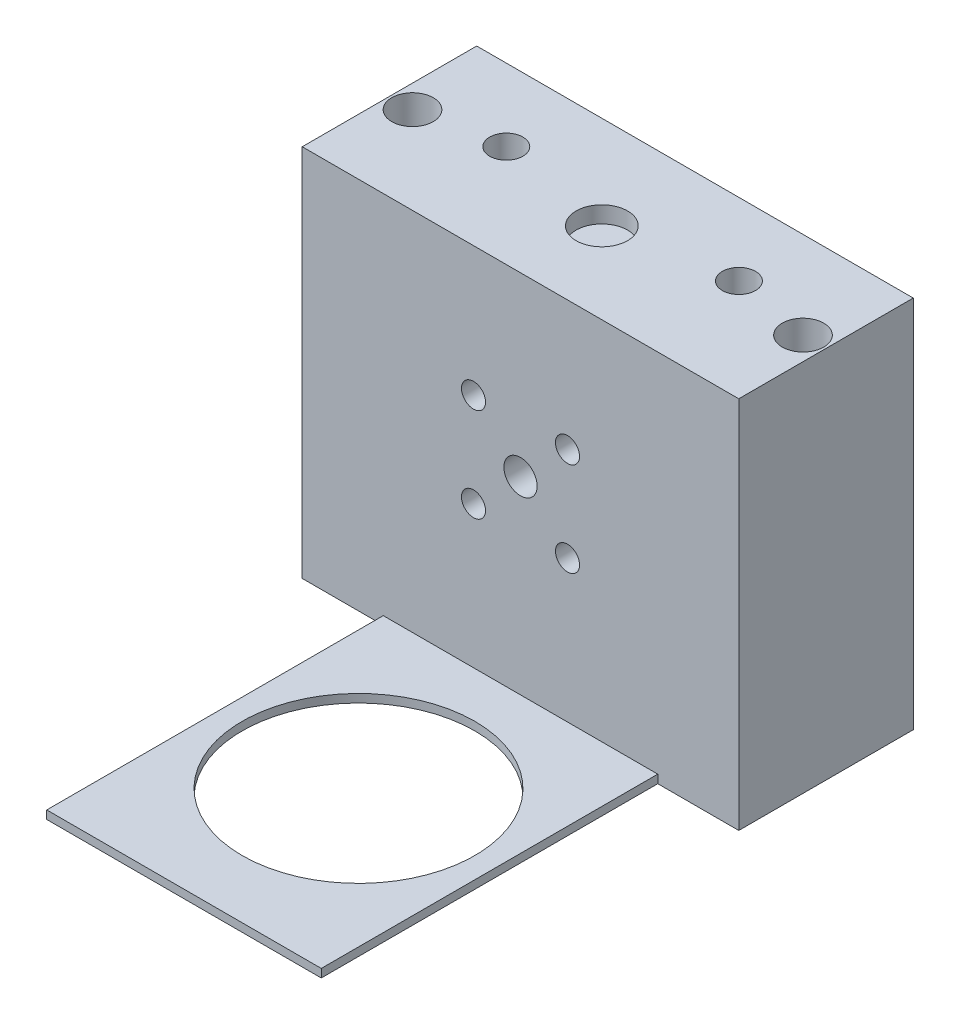
ISO-10303-21;
HEADER;
FILE_DESCRIPTION(('STEP AP214'),'2;1');
FILE_NAME('part.step','',(''),(''),'','','');
FILE_SCHEMA(('AUTOMOTIVE_DESIGN { 1 0 10303 214 1 1 1 1 }'));
ENDSEC;
DATA;
#1=APPLICATION_CONTEXT('core data for automotive mechanical design processes');
#2=APPLICATION_PROTOCOL_DEFINITION('international standard','automotive_design',2000,#1);
#3=PRODUCT_CONTEXT('',#1,'mechanical');
#4=PRODUCT('Part','Part','',(#3));
#5=PRODUCT_RELATED_PRODUCT_CATEGORY('part','',(#4));
#6=PRODUCT_DEFINITION_FORMATION('','',#4);
#7=PRODUCT_DEFINITION_CONTEXT('part definition',#1,'design');
#8=PRODUCT_DEFINITION('design','',#6,#7);
#9=PRODUCT_DEFINITION_SHAPE('','',#8);
#10=(LENGTH_UNIT() NAMED_UNIT(*) SI_UNIT(.MILLI.,.METRE.));
#11=(NAMED_UNIT(*) PLANE_ANGLE_UNIT() SI_UNIT($,.RADIAN.));
#12=(NAMED_UNIT(*) SI_UNIT($,.STERADIAN.) SOLID_ANGLE_UNIT());
#13=UNCERTAINTY_MEASURE_WITH_UNIT(LENGTH_MEASURE(1.E-05),#10,'distance_accuracy_value','');
#14=(GEOMETRIC_REPRESENTATION_CONTEXT(3) GLOBAL_UNCERTAINTY_ASSIGNED_CONTEXT((#13)) GLOBAL_UNIT_ASSIGNED_CONTEXT((#10,
#11,#12)) REPRESENTATION_CONTEXT('',''));
#15=CARTESIAN_POINT('',(0.,0.,0.));
#16=DIRECTION('',(0.,0.,1.));
#17=DIRECTION('',(1.,0.,0.));
#18=AXIS2_PLACEMENT_3D('',#15,#16,#17);
#19=CARTESIAN_POINT('',(-26.27,45.,10.5));
#20=DIRECTION('',(0.,0.,-1.));
#21=DIRECTION('',(-1.,0.,0.));
#22=AXIS2_PLACEMENT_3D('',#19,#20,#21);
#23=PLANE('',#22);
#24=CARTESIAN_POINT('',(0.,23.75,10.5));
#25=DIRECTION('',(0.,0.,-1.));
#26=DIRECTION('',(-1.,0.,0.));
#27=AXIS2_PLACEMENT_3D('',#24,#25,#26);
#28=CIRCLE('',#27,2.);
#29=CARTESIAN_POINT('',(-2.,23.75,10.5));
#30=VERTEX_POINT('',#29);
#31=EDGE_CURVE('E208',#30,#30,#28,.T.);
#32=ORIENTED_EDGE('',*,*,#31,.T.);
#33=EDGE_LOOP('',(#32));
#34=FACE_BOUND('',#33,.T.);
#35=CARTESIAN_POINT('',(-5.65685424949243,29.4068542494924,10.5));
#36=DIRECTION('',(0.,0.,-1.));
#37=DIRECTION('',(-1.,0.,0.));
#38=AXIS2_PLACEMENT_3D('',#35,#36,#37);
#39=CIRCLE('',#38,1.44999999999999);
#40=CARTESIAN_POINT('',(-7.10685424949243,29.4068542494924,10.5));
#41=VERTEX_POINT('',#40);
#42=EDGE_CURVE('E192',#41,#41,#39,.T.);
#43=ORIENTED_EDGE('',*,*,#42,.T.);
#44=EDGE_LOOP('',(#43));
#45=FACE_BOUND('',#44,.T.);
#46=CARTESIAN_POINT('',(5.65685424949234,29.4068542494924,10.5));
#47=DIRECTION('',(0.,0.,-1.));
#48=DIRECTION('',(-1.,0.,0.));
#49=AXIS2_PLACEMENT_3D('',#46,#47,#48);
#50=CIRCLE('',#49,1.44999999999999);
#51=CARTESIAN_POINT('',(4.20685424949234,29.4068542494924,10.5));
#52=VERTEX_POINT('',#51);
#53=EDGE_CURVE('E180',#52,#52,#50,.T.);
#54=ORIENTED_EDGE('',*,*,#53,.T.);
#55=EDGE_LOOP('',(#54));
#56=FACE_BOUND('',#55,.T.);
#57=CARTESIAN_POINT('',(5.65685424949242,18.0931457505077,10.5));
#58=DIRECTION('',(0.,0.,-1.));
#59=DIRECTION('',(-1.,0.,0.));
#60=AXIS2_PLACEMENT_3D('',#57,#58,#59);
#61=CIRCLE('',#60,1.44999999999999);
#62=CARTESIAN_POINT('',(4.20685424949243,18.0931457505077,10.5));
#63=VERTEX_POINT('',#62);
#64=EDGE_CURVE('E168',#63,#63,#61,.T.);
#65=ORIENTED_EDGE('',*,*,#64,.T.);
#66=EDGE_LOOP('',(#65));
#67=FACE_BOUND('',#66,.T.);
#68=CARTESIAN_POINT('',(-5.65685424949234,18.0931457505076,10.5));
#69=DIRECTION('',(0.,0.,-1.));
#70=DIRECTION('',(-1.,0.,0.));
#71=AXIS2_PLACEMENT_3D('',#68,#69,#70);
#72=CIRCLE('',#71,1.44999999999999);
#73=CARTESIAN_POINT('',(-7.10685424949233,18.0931457505076,10.5));
#74=VERTEX_POINT('',#73);
#75=EDGE_CURVE('E156',#74,#74,#72,.T.);
#76=ORIENTED_EDGE('',*,*,#75,.T.);
#77=EDGE_LOOP('',(#76));
#78=FACE_BOUND('',#77,.T.);
#79=DIRECTION('',(0.,-1.,0.));
#80=VECTOR('',#79,1.);
#81=CARTESIAN_POINT('',(-16.52,1.,10.5));
#82=LINE('',#81,#80);
#83=CARTESIAN_POINT('',(-16.52,1.,10.5));
#84=VERTEX_POINT('',#83);
#85=CARTESIAN_POINT('',(-16.52,0.,10.5));
#86=VERTEX_POINT('',#85);
#87=EDGE_CURVE('E124',#84,#86,#82,.T.);
#88=ORIENTED_EDGE('',*,*,#87,.F.);
#89=DIRECTION('',(1.,0.,0.));
#90=VECTOR('',#89,1.);
#91=CARTESIAN_POINT('',(-16.52,1.,10.5));
#92=LINE('',#91,#90);
#93=CARTESIAN_POINT('',(16.52,1.,10.5));
#94=VERTEX_POINT('',#93);
#95=EDGE_CURVE('E111',#84,#94,#92,.T.);
#96=ORIENTED_EDGE('',*,*,#95,.T.);
#97=DIRECTION('',(0.,-1.,0.));
#98=VECTOR('',#97,1.);
#99=CARTESIAN_POINT('',(16.52,1.,10.5));
#100=LINE('',#99,#98);
#101=CARTESIAN_POINT('',(16.52,0.,10.5));
#102=VERTEX_POINT('',#101);
#103=EDGE_CURVE('E133',#94,#102,#100,.T.);
#104=ORIENTED_EDGE('',*,*,#103,.T.);
#105=DIRECTION('',(1.,0.,0.));
#106=VECTOR('',#105,1.);
#107=CARTESIAN_POINT('',(-26.27,0.,10.5));
#108=LINE('',#107,#106);
#109=CARTESIAN_POINT('',(26.27,0.,10.5));
#110=VERTEX_POINT('',#109);
#111=EDGE_CURVE('E81',#102,#110,#108,.T.);
#112=ORIENTED_EDGE('',*,*,#111,.T.);
#113=DIRECTION('',(0.,-1.,0.));
#114=VECTOR('',#113,1.);
#115=CARTESIAN_POINT('',(26.27,45.,10.5));
#116=LINE('',#115,#114);
#117=CARTESIAN_POINT('',(26.27,45.,10.5));
#118=VERTEX_POINT('',#117);
#119=EDGE_CURVE('E232',#118,#110,#116,.T.);
#120=ORIENTED_EDGE('',*,*,#119,.F.);
#121=DIRECTION('',(1.,0.,0.));
#122=VECTOR('',#121,1.);
#123=CARTESIAN_POINT('',(-26.27,45.,10.5));
#124=LINE('',#123,#122);
#125=CARTESIAN_POINT('',(-26.27,45.,10.5));
#126=VERTEX_POINT('',#125);
#127=EDGE_CURVE('E61',#126,#118,#124,.T.);
#128=ORIENTED_EDGE('',*,*,#127,.F.);
#129=DIRECTION('',(0.,-1.,0.));
#130=VECTOR('',#129,1.);
#131=CARTESIAN_POINT('',(-26.27,45.,10.5));
#132=LINE('',#131,#130);
#133=CARTESIAN_POINT('',(-26.27,0.,10.5));
#134=VERTEX_POINT('',#133);
#135=EDGE_CURVE('E241',#126,#134,#132,.T.);
#136=ORIENTED_EDGE('',*,*,#135,.T.);
#137=EDGE_CURVE('E132',#134,#86,#108,.T.);
#138=ORIENTED_EDGE('',*,*,#137,.T.);
#139=EDGE_LOOP('',(#88,#96,#104,#112,#120,#128,#136,#138));
#140=FACE_BOUND('',#139,.T.);
#141=ADVANCED_FACE('F37',(#34,#45,#56,#67,#78,#140),#23,.F.);
#142=CARTESIAN_POINT('',(0.,45.,0.));
#143=DIRECTION('',(0.,-1.,0.));
#144=DIRECTION('',(0.,0.,-1.));
#145=AXIS2_PLACEMENT_3D('',#142,#143,#144);
#146=PLANE('',#145);
#147=CARTESIAN_POINT('',(0.,45.,0.710000000000004));
#148=DIRECTION('',(0.,1.,0.));
#149=DIRECTION('',(0.,0.,1.));
#150=AXIS2_PLACEMENT_3D('',#147,#148,#149);
#151=CIRCLE('',#150,3.1);
#152=CARTESIAN_POINT('',(0.,45.,3.81));
#153=VERTEX_POINT('',#152);
#154=EDGE_CURVE('E145',#153,#153,#151,.T.);
#155=ORIENTED_EDGE('',*,*,#154,.F.);
#156=EDGE_LOOP('',(#155));
#157=FACE_BOUND('',#156,.T.);
#158=CARTESIAN_POINT('',(-14.,45.,-1.79));
#159=DIRECTION('',(0.,1.,0.));
#160=DIRECTION('',(0.,0.,1.));
#161=AXIS2_PLACEMENT_3D('',#158,#159,#160);
#162=CIRCLE('',#161,2.);
#163=CARTESIAN_POINT('',(-14.,45.,0.21));
#164=VERTEX_POINT('',#163);
#165=EDGE_CURVE('E200',#164,#164,#162,.T.);
#166=ORIENTED_EDGE('',*,*,#165,.F.);
#167=EDGE_LOOP('',(#166));
#168=FACE_BOUND('',#167,.T.);
#169=CARTESIAN_POINT('',(14.,45.,-1.79));
#170=DIRECTION('',(0.,1.,0.));
#171=DIRECTION('',(0.,0.,1.));
#172=AXIS2_PLACEMENT_3D('',#169,#170,#171);
#173=CIRCLE('',#172,2.);
#174=CARTESIAN_POINT('',(14.,45.,0.210000000000001));
#175=VERTEX_POINT('',#174);
#176=EDGE_CURVE('E203',#175,#175,#173,.T.);
#177=ORIENTED_EDGE('',*,*,#176,.F.);
#178=EDGE_LOOP('',(#177));
#179=FACE_BOUND('',#178,.T.);
#180=DIRECTION('',(0.,0.,-1.));
#181=VECTOR('',#180,1.);
#182=CARTESIAN_POINT('',(26.27,45.,10.5));
#183=LINE('',#182,#181);
#184=CARTESIAN_POINT('',(26.27,45.,-10.5));
#185=VERTEX_POINT('',#184);
#186=EDGE_CURVE('E226',#118,#185,#183,.T.);
#187=ORIENTED_EDGE('',*,*,#186,.T.);
#188=DIRECTION('',(-1.,0.,0.));
#189=VECTOR('',#188,1.);
#190=CARTESIAN_POINT('',(-26.27,45.,-10.5));
#191=LINE('',#190,#189);
#192=CARTESIAN_POINT('',(-26.27,45.,-10.5));
#193=VERTEX_POINT('',#192);
#194=EDGE_CURVE('E88',#185,#193,#191,.T.);
#195=ORIENTED_EDGE('',*,*,#194,.T.);
#196=DIRECTION('',(0.,0.,1.));
#197=VECTOR('',#196,1.);
#198=CARTESIAN_POINT('',(-26.27,45.,10.5));
#199=LINE('',#198,#197);
#200=EDGE_CURVE('E229',#193,#126,#199,.T.);
#201=ORIENTED_EDGE('',*,*,#200,.T.);
#202=ORIENTED_EDGE('',*,*,#127,.T.);
#203=EDGE_LOOP('',(#187,#195,#201,#202));
#204=FACE_BOUND('',#203,.T.);
#205=CARTESIAN_POINT('',(23.5,45.,0.));
#206=DIRECTION('',(0.,1.,0.));
#207=DIRECTION('',(0.,0.,1.));
#208=AXIS2_PLACEMENT_3D('',#205,#206,#207);
#209=CIRCLE('',#208,2.5);
#210=CARTESIAN_POINT('',(23.5,45.,-2.50000000000001));
#211=VERTEX_POINT('',#210);
#212=EDGE_CURVE('E220',#211,#211,#209,.T.);
#213=ORIENTED_EDGE('',*,*,#212,.F.);
#214=EDGE_LOOP('',(#213));
#215=FACE_BOUND('',#214,.T.);
#216=CARTESIAN_POINT('',(-23.5,45.,0.));
#217=DIRECTION('',(0.,1.,0.));
#218=DIRECTION('',(0.,0.,1.));
#219=AXIS2_PLACEMENT_3D('',#216,#217,#218);
#220=CIRCLE('',#219,2.5);
#221=CARTESIAN_POINT('',(-23.5,45.,-2.5));
#222=VERTEX_POINT('',#221);
#223=EDGE_CURVE('E214',#222,#222,#220,.T.);
#224=ORIENTED_EDGE('',*,*,#223,.F.);
#225=EDGE_LOOP('',(#224));
#226=FACE_BOUND('',#225,.T.);
#227=ADVANCED_FACE('F278',(#157,#168,#179,#204,#215,#226),#146,.F.);
#228=CARTESIAN_POINT('',(0.,0.,0.));
#229=DIRECTION('',(0.,-1.,0.));
#230=DIRECTION('',(0.,0.,-1.));
#231=AXIS2_PLACEMENT_3D('',#228,#229,#230);
#232=PLANE('',#231);
#233=CARTESIAN_POINT('',(23.5,0.,0.));
#234=DIRECTION('',(0.,1.,0.));
#235=DIRECTION('',(0.,0.,1.));
#236=AXIS2_PLACEMENT_3D('',#233,#234,#235);
#237=CIRCLE('',#236,2.5);
#238=CARTESIAN_POINT('',(23.5,0.,-2.50000000000001));
#239=VERTEX_POINT('',#238);
#240=EDGE_CURVE('E217',#239,#239,#237,.T.);
#241=ORIENTED_EDGE('',*,*,#240,.T.);
#242=EDGE_LOOP('',(#241));
#243=FACE_BOUND('',#242,.T.);
#244=DIRECTION('',(0.,0.,-1.));
#245=VECTOR('',#244,1.);
#246=CARTESIAN_POINT('',(26.27,0.,10.5));
#247=LINE('',#246,#245);
#248=CARTESIAN_POINT('',(26.27,0.,-10.5));
#249=VERTEX_POINT('',#248);
#250=EDGE_CURVE('E223',#110,#249,#247,.T.);
#251=ORIENTED_EDGE('',*,*,#250,.F.);
#252=ORIENTED_EDGE('',*,*,#111,.F.);
#253=DIRECTION('',(0.,0.,1.));
#254=VECTOR('',#253,1.);
#255=CARTESIAN_POINT('',(16.52,0.,10.5));
#256=LINE('',#255,#254);
#257=CARTESIAN_POINT('',(16.52,0.,51.));
#258=VERTEX_POINT('',#257);
#259=EDGE_CURVE('E52',#102,#258,#256,.T.);
#260=ORIENTED_EDGE('',*,*,#259,.T.);
#261=DIRECTION('',(-1.,0.,0.));
#262=VECTOR('',#261,1.);
#263=CARTESIAN_POINT('',(-16.52,0.,51.));
#264=LINE('',#263,#262);
#265=CARTESIAN_POINT('',(-16.52,0.,51.));
#266=VERTEX_POINT('',#265);
#267=EDGE_CURVE('E127',#258,#266,#264,.T.);
#268=ORIENTED_EDGE('',*,*,#267,.T.);
#269=DIRECTION('',(0.,0.,-1.));
#270=VECTOR('',#269,1.);
#271=CARTESIAN_POINT('',(-16.52,0.,10.5));
#272=LINE('',#271,#270);
#273=EDGE_CURVE('E253',#266,#86,#272,.T.);
#274=ORIENTED_EDGE('',*,*,#273,.T.);
#275=ORIENTED_EDGE('',*,*,#137,.F.);
#276=DIRECTION('',(0.,0.,1.));
#277=VECTOR('',#276,1.);
#278=CARTESIAN_POINT('',(-26.27,0.,10.5));
#279=LINE('',#278,#277);
#280=CARTESIAN_POINT('',(-26.27,0.,-10.5));
#281=VERTEX_POINT('',#280);
#282=EDGE_CURVE('E237',#281,#134,#279,.T.);
#283=ORIENTED_EDGE('',*,*,#282,.F.);
#284=DIRECTION('',(-1.,0.,0.));
#285=VECTOR('',#284,1.);
#286=CARTESIAN_POINT('',(-26.27,0.,-10.5));
#287=LINE('',#286,#285);
#288=EDGE_CURVE('E235',#249,#281,#287,.T.);
#289=ORIENTED_EDGE('',*,*,#288,.F.);
#290=EDGE_LOOP('',(#251,#252,#260,#268,#274,#275,#283,#289));
#291=FACE_BOUND('',#290,.T.);
#292=CARTESIAN_POINT('',(-23.5,0.,0.));
#293=DIRECTION('',(0.,1.,0.));
#294=DIRECTION('',(0.,0.,1.));
#295=AXIS2_PLACEMENT_3D('',#292,#293,#294);
#296=CIRCLE('',#295,2.5);
#297=CARTESIAN_POINT('',(-23.5,0.,-2.5));
#298=VERTEX_POINT('',#297);
#299=EDGE_CURVE('E211',#298,#298,#296,.T.);
#300=ORIENTED_EDGE('',*,*,#299,.T.);
#301=EDGE_LOOP('',(#300));
#302=FACE_BOUND('',#301,.T.);
#303=CARTESIAN_POINT('',(0.,0.,30.));
#304=DIRECTION('',(0.,-1.,0.));
#305=DIRECTION('',(0.,0.,-1.));
#306=AXIS2_PLACEMENT_3D('',#303,#304,#305);
#307=CIRCLE('',#306,14.);
#308=CARTESIAN_POINT('',(0.,0.,16.));
#309=VERTEX_POINT('',#308);
#310=EDGE_CURVE('E259',#309,#309,#307,.T.);
#311=ORIENTED_EDGE('',*,*,#310,.F.);
#312=EDGE_LOOP('',(#311));
#313=FACE_BOUND('',#312,.T.);
#314=ADVANCED_FACE('F250',(#243,#291,#302,#313),#232,.T.);
#315=CARTESIAN_POINT('',(26.27,45.,10.5));
#316=DIRECTION('',(-1.,0.,0.));
#317=DIRECTION('',(0.,0.,1.));
#318=AXIS2_PLACEMENT_3D('',#315,#316,#317);
#319=PLANE('',#318);
#320=ORIENTED_EDGE('',*,*,#250,.T.);
#321=DIRECTION('',(0.,-1.,0.));
#322=VECTOR('',#321,1.);
#323=CARTESIAN_POINT('',(26.27,45.,-10.5));
#324=LINE('',#323,#322);
#325=EDGE_CURVE('E11',#185,#249,#324,.T.);
#326=ORIENTED_EDGE('',*,*,#325,.F.);
#327=ORIENTED_EDGE('',*,*,#186,.F.);
#328=ORIENTED_EDGE('',*,*,#119,.T.);
#329=EDGE_LOOP('',(#320,#326,#327,#328));
#330=FACE_BOUND('',#329,.T.);
#331=ADVANCED_FACE('F39',(#330),#319,.F.);
#332=CARTESIAN_POINT('',(-26.27,45.,-10.5));
#333=DIRECTION('',(0.,0.,1.));
#334=DIRECTION('',(1.,0.,0.));
#335=AXIS2_PLACEMENT_3D('',#332,#333,#334);
#336=PLANE('',#335);
#337=CARTESIAN_POINT('',(-5.65685424949234,18.0931457505076,-10.5));
#338=DIRECTION('',(0.,0.,-1.));
#339=DIRECTION('',(-1.,0.,0.));
#340=AXIS2_PLACEMENT_3D('',#337,#338,#339);
#341=CIRCLE('',#340,2.75);
#342=CARTESIAN_POINT('',(-8.40685424949234,18.0931457505076,-10.5));
#343=VERTEX_POINT('',#342);
#344=EDGE_CURVE('E144',#343,#343,#341,.T.);
#345=ORIENTED_EDGE('',*,*,#344,.F.);
#346=EDGE_LOOP('',(#345));
#347=FACE_BOUND('',#346,.T.);
#348=CARTESIAN_POINT('',(5.65685424949242,18.0931457505077,-10.5));
#349=DIRECTION('',(0.,0.,-1.));
#350=DIRECTION('',(-1.,0.,0.));
#351=AXIS2_PLACEMENT_3D('',#348,#349,#350);
#352=CIRCLE('',#351,2.75);
#353=CARTESIAN_POINT('',(2.90685424949242,18.0931457505077,-10.5));
#354=VERTEX_POINT('',#353);
#355=EDGE_CURVE('E159',#354,#354,#352,.T.);
#356=ORIENTED_EDGE('',*,*,#355,.F.);
#357=EDGE_LOOP('',(#356));
#358=FACE_BOUND('',#357,.T.);
#359=CARTESIAN_POINT('',(5.65685424949234,29.4068542494924,-10.5));
#360=DIRECTION('',(0.,0.,-1.));
#361=DIRECTION('',(-1.,0.,0.));
#362=AXIS2_PLACEMENT_3D('',#359,#360,#361);
#363=CIRCLE('',#362,2.75);
#364=CARTESIAN_POINT('',(2.90685424949234,29.4068542494924,-10.5));
#365=VERTEX_POINT('',#364);
#366=EDGE_CURVE('E171',#365,#365,#363,.T.);
#367=ORIENTED_EDGE('',*,*,#366,.F.);
#368=EDGE_LOOP('',(#367));
#369=FACE_BOUND('',#368,.T.);
#370=CARTESIAN_POINT('',(-5.65685424949243,29.4068542494924,-10.5));
#371=DIRECTION('',(0.,0.,-1.));
#372=DIRECTION('',(-1.,0.,0.));
#373=AXIS2_PLACEMENT_3D('',#370,#371,#372);
#374=CIRCLE('',#373,2.75);
#375=CARTESIAN_POINT('',(-8.40685424949243,29.4068542494924,-10.5));
#376=VERTEX_POINT('',#375);
#377=EDGE_CURVE('E183',#376,#376,#374,.T.);
#378=ORIENTED_EDGE('',*,*,#377,.F.);
#379=EDGE_LOOP('',(#378));
#380=FACE_BOUND('',#379,.T.);
#381=CARTESIAN_POINT('',(0.,23.75,-10.5));
#382=DIRECTION('',(0.,0.,-1.));
#383=DIRECTION('',(-1.,0.,0.));
#384=AXIS2_PLACEMENT_3D('',#381,#382,#383);
#385=CIRCLE('',#384,2.);
#386=CARTESIAN_POINT('',(-2.,23.75,-10.5));
#387=VERTEX_POINT('',#386);
#388=EDGE_CURVE('E199',#387,#387,#385,.T.);
#389=ORIENTED_EDGE('',*,*,#388,.F.);
#390=EDGE_LOOP('',(#389));
#391=FACE_BOUND('',#390,.T.);
#392=ORIENTED_EDGE('',*,*,#288,.T.);
#393=DIRECTION('',(0.,-1.,0.));
#394=VECTOR('',#393,1.);
#395=CARTESIAN_POINT('',(-26.27,45.,-10.5));
#396=LINE('',#395,#394);
#397=EDGE_CURVE('E45',#193,#281,#396,.T.);
#398=ORIENTED_EDGE('',*,*,#397,.F.);
#399=ORIENTED_EDGE('',*,*,#194,.F.);
#400=ORIENTED_EDGE('',*,*,#325,.T.);
#401=EDGE_LOOP('',(#392,#398,#399,#400));
#402=FACE_BOUND('',#401,.T.);
#403=ADVANCED_FACE('F293',(#347,#358,#369,#380,#391,#402),#336,.F.);
#404=CARTESIAN_POINT('',(-26.27,45.,10.5));
#405=DIRECTION('',(1.,0.,0.));
#406=DIRECTION('',(0.,0.,-1.));
#407=AXIS2_PLACEMENT_3D('',#404,#405,#406);
#408=PLANE('',#407);
#409=ORIENTED_EDGE('',*,*,#282,.T.);
#410=ORIENTED_EDGE('',*,*,#135,.F.);
#411=ORIENTED_EDGE('',*,*,#200,.F.);
#412=ORIENTED_EDGE('',*,*,#397,.T.);
#413=EDGE_LOOP('',(#409,#410,#411,#412));
#414=FACE_BOUND('',#413,.T.);
#415=ADVANCED_FACE('F246',(#414),#408,.F.);
#416=CARTESIAN_POINT('',(23.5,45.,0.));
#417=DIRECTION('',(0.,-1.,0.));
#418=DIRECTION('',(0.,0.,-1.));
#419=AXIS2_PLACEMENT_3D('',#416,#417,#418);
#420=CYLINDRICAL_SURFACE('',#419,2.5);
#421=CARTESIAN_POINT('',(23.5,45.,-2.50000000000001));
#422=CARTESIAN_POINT('',(23.5,44.53125,-2.50000000000001));
#423=CARTESIAN_POINT('',(23.5,44.0625,-2.50000000000001));
#424=CARTESIAN_POINT('',(23.5,43.125,-2.50000000000001));
#425=CARTESIAN_POINT('',(23.5,42.65625,-2.50000000000001));
#426=CARTESIAN_POINT('',(23.5,41.71875,-2.50000000000001));
#427=CARTESIAN_POINT('',(23.5,41.25,-2.50000000000001));
#428=CARTESIAN_POINT('',(23.5,40.3125,-2.50000000000001));
#429=CARTESIAN_POINT('',(23.5,39.84375,-2.50000000000001));
#430=CARTESIAN_POINT('',(23.5,38.90625,-2.50000000000001));
#431=CARTESIAN_POINT('',(23.5,38.4375,-2.50000000000001));
#432=CARTESIAN_POINT('',(23.5,37.5,-2.50000000000001));
#433=CARTESIAN_POINT('',(23.5,37.03125,-2.50000000000001));
#434=CARTESIAN_POINT('',(23.5,36.09375,-2.50000000000001));
#435=CARTESIAN_POINT('',(23.5,35.625,-2.50000000000001));
#436=CARTESIAN_POINT('',(23.5,34.6875,-2.50000000000001));
#437=CARTESIAN_POINT('',(23.5,34.21875,-2.50000000000001));
#438=CARTESIAN_POINT('',(23.5,33.28125,-2.50000000000001));
#439=CARTESIAN_POINT('',(23.5,32.8125,-2.50000000000001));
#440=CARTESIAN_POINT('',(23.5,31.875,-2.50000000000001));
#441=CARTESIAN_POINT('',(23.5,31.40625,-2.50000000000001));
#442=CARTESIAN_POINT('',(23.5,30.46875,-2.50000000000001));
#443=CARTESIAN_POINT('',(23.5,30.,-2.50000000000001));
#444=CARTESIAN_POINT('',(23.5,29.0625,-2.50000000000001));
#445=CARTESIAN_POINT('',(23.5,28.59375,-2.50000000000001));
#446=CARTESIAN_POINT('',(23.5,27.65625,-2.50000000000001));
#447=CARTESIAN_POINT('',(23.5,27.1875,-2.50000000000001));
#448=CARTESIAN_POINT('',(23.5,26.25,-2.50000000000001));
#449=CARTESIAN_POINT('',(23.5,25.78125,-2.50000000000001));
#450=CARTESIAN_POINT('',(23.5,24.84375,-2.50000000000001));
#451=CARTESIAN_POINT('',(23.5,24.375,-2.50000000000001));
#452=CARTESIAN_POINT('',(23.5,23.4375,-2.50000000000001));
#453=CARTESIAN_POINT('',(23.5,22.96875,-2.50000000000001));
#454=CARTESIAN_POINT('',(23.5,22.03125,-2.50000000000001));
#455=CARTESIAN_POINT('',(23.5,21.5625,-2.50000000000001));
#456=CARTESIAN_POINT('',(23.5,20.625,-2.50000000000001));
#457=CARTESIAN_POINT('',(23.5,20.15625,-2.50000000000001));
#458=CARTESIAN_POINT('',(23.5,19.21875,-2.50000000000001));
#459=CARTESIAN_POINT('',(23.5,18.75,-2.50000000000001));
#460=CARTESIAN_POINT('',(23.5,17.8125,-2.50000000000001));
#461=CARTESIAN_POINT('',(23.5,17.34375,-2.50000000000001));
#462=CARTESIAN_POINT('',(23.5,16.40625,-2.50000000000001));
#463=CARTESIAN_POINT('',(23.5,15.9375,-2.50000000000001));
#464=CARTESIAN_POINT('',(23.5,15.,-2.50000000000001));
#465=CARTESIAN_POINT('',(23.5,14.53125,-2.50000000000001));
#466=CARTESIAN_POINT('',(23.5,13.59375,-2.50000000000001));
#467=CARTESIAN_POINT('',(23.5,13.125,-2.50000000000001));
#468=CARTESIAN_POINT('',(23.5,12.1875,-2.50000000000001));
#469=CARTESIAN_POINT('',(23.5,11.71875,-2.50000000000001));
#470=CARTESIAN_POINT('',(23.5,10.78125,-2.50000000000001));
#471=CARTESIAN_POINT('',(23.5,10.3125,-2.50000000000001));
#472=CARTESIAN_POINT('',(23.5,9.37499999999999,-2.50000000000001));
#473=CARTESIAN_POINT('',(23.5,8.90624999999999,-2.50000000000001));
#474=CARTESIAN_POINT('',(23.5,7.96874999999999,-2.50000000000001));
#475=CARTESIAN_POINT('',(23.5,7.5,-2.50000000000001));
#476=CARTESIAN_POINT('',(23.5,6.56249999999999,-2.50000000000001));
#477=CARTESIAN_POINT('',(23.5,6.09374999999999,-2.50000000000001));
#478=CARTESIAN_POINT('',(23.5,5.15624999999999,-2.50000000000001));
#479=CARTESIAN_POINT('',(23.5,4.68749999999999,-2.50000000000001));
#480=CARTESIAN_POINT('',(23.5,3.74999999999999,-2.50000000000001));
#481=CARTESIAN_POINT('',(23.5,3.28124999999999,-2.50000000000001));
#482=CARTESIAN_POINT('',(23.5,2.34374999999999,-2.50000000000001));
#483=CARTESIAN_POINT('',(23.5,1.87499999999999,-2.50000000000001));
#484=CARTESIAN_POINT('',(23.5,0.937499999999992,-2.50000000000001));
#485=CARTESIAN_POINT('',(23.5,0.468749999999993,-2.50000000000001));
#486=CARTESIAN_POINT('',(23.5,0.,-2.50000000000001));
#487=B_SPLINE_CURVE_WITH_KNOTS('',3,(#421,#422,#423,#424,#425,#426,#427,#428,#429,#430,#431,
#432,#433,#434,#435,#436,#437,#438,#439,#440,#441,#442,#443,#444,#445,#446,#447,#448,#449,#450,
#451,#452,#453,#454,#455,#456,#457,#458,#459,#460,#461,#462,#463,#464,#465,#466,#467,#468,#469,
#470,#471,#472,#473,#474,#475,#476,#477,#478,#479,#480,#481,#482,#483,#484,#485,#486),
.UNSPECIFIED.,.F.,.F.,(4,2,2,2,2,2,2,2,2,2,2,2,2,2,2,2,2,2,2,2,2,2,2,2,2,2,2,2,2,2,2,2,4),(0.,
1.40625,2.8125,4.21874999999999,5.625,7.03125,8.43749999999999,9.84375,11.25,12.65625,14.0625,
15.46875,16.875,18.28125,19.6875,21.09375,22.5,23.90625,25.3125,26.71875,28.125,29.53125,
30.9375,32.34375,33.75,35.15625,36.5625,37.96875,39.375,40.78125,42.1875,43.59375,45.),.UNSPECIFIED.);
#488=EDGE_CURVE('BSEAM292',#211,#239,#487,.T.);
#489=ORIENTED_EDGE('',*,*,#212,.T.);
#490=ORIENTED_EDGE('',*,*,#240,.F.);
#491=ORIENTED_EDGE('',*,*,#488,.T.);
#492=ORIENTED_EDGE('',*,*,#488,.F.);
#493=EDGE_LOOP('',(#489,#491,#490,#492));
#494=FACE_BOUND('',#493,.T.);
#495=ADVANCED_FACE('F292',(#494),#420,.F.);
#496=CARTESIAN_POINT('',(-23.5,45.,0.));
#497=DIRECTION('',(0.,-1.,0.));
#498=DIRECTION('',(0.,0.,-1.));
#499=AXIS2_PLACEMENT_3D('',#496,#497,#498);
#500=CYLINDRICAL_SURFACE('',#499,2.5);
#501=CARTESIAN_POINT('',(-23.5,45.,-2.5));
#502=CARTESIAN_POINT('',(-23.5,44.53125,-2.5));
#503=CARTESIAN_POINT('',(-23.5,44.0625,-2.5));
#504=CARTESIAN_POINT('',(-23.5,43.125,-2.5));
#505=CARTESIAN_POINT('',(-23.5,42.65625,-2.5));
#506=CARTESIAN_POINT('',(-23.5,41.71875,-2.5));
#507=CARTESIAN_POINT('',(-23.5,41.25,-2.5));
#508=CARTESIAN_POINT('',(-23.5,40.3125,-2.5));
#509=CARTESIAN_POINT('',(-23.5,39.84375,-2.5));
#510=CARTESIAN_POINT('',(-23.5,38.90625,-2.5));
#511=CARTESIAN_POINT('',(-23.5,38.4375,-2.5));
#512=CARTESIAN_POINT('',(-23.5,37.5,-2.5));
#513=CARTESIAN_POINT('',(-23.5,37.03125,-2.5));
#514=CARTESIAN_POINT('',(-23.5,36.09375,-2.5));
#515=CARTESIAN_POINT('',(-23.5,35.625,-2.5));
#516=CARTESIAN_POINT('',(-23.5,34.6875,-2.5));
#517=CARTESIAN_POINT('',(-23.5,34.21875,-2.5));
#518=CARTESIAN_POINT('',(-23.5,33.28125,-2.5));
#519=CARTESIAN_POINT('',(-23.5,32.8125,-2.5));
#520=CARTESIAN_POINT('',(-23.5,31.875,-2.5));
#521=CARTESIAN_POINT('',(-23.5,31.40625,-2.5));
#522=CARTESIAN_POINT('',(-23.5,30.46875,-2.5));
#523=CARTESIAN_POINT('',(-23.5,30.,-2.5));
#524=CARTESIAN_POINT('',(-23.5,29.0625,-2.5));
#525=CARTESIAN_POINT('',(-23.5,28.59375,-2.5));
#526=CARTESIAN_POINT('',(-23.5,27.65625,-2.5));
#527=CARTESIAN_POINT('',(-23.5,27.1875,-2.5));
#528=CARTESIAN_POINT('',(-23.5,26.25,-2.5));
#529=CARTESIAN_POINT('',(-23.5,25.78125,-2.5));
#530=CARTESIAN_POINT('',(-23.5,24.84375,-2.5));
#531=CARTESIAN_POINT('',(-23.5,24.375,-2.5));
#532=CARTESIAN_POINT('',(-23.5,23.4375,-2.5));
#533=CARTESIAN_POINT('',(-23.5,22.96875,-2.5));
#534=CARTESIAN_POINT('',(-23.5,22.03125,-2.5));
#535=CARTESIAN_POINT('',(-23.5,21.5625,-2.5));
#536=CARTESIAN_POINT('',(-23.5,20.625,-2.5));
#537=CARTESIAN_POINT('',(-23.5,20.15625,-2.5));
#538=CARTESIAN_POINT('',(-23.5,19.21875,-2.5));
#539=CARTESIAN_POINT('',(-23.5,18.75,-2.5));
#540=CARTESIAN_POINT('',(-23.5,17.8125,-2.5));
#541=CARTESIAN_POINT('',(-23.5,17.34375,-2.5));
#542=CARTESIAN_POINT('',(-23.5,16.40625,-2.5));
#543=CARTESIAN_POINT('',(-23.5,15.9375,-2.5));
#544=CARTESIAN_POINT('',(-23.5,15.,-2.5));
#545=CARTESIAN_POINT('',(-23.5,14.53125,-2.5));
#546=CARTESIAN_POINT('',(-23.5,13.59375,-2.5));
#547=CARTESIAN_POINT('',(-23.5,13.125,-2.5));
#548=CARTESIAN_POINT('',(-23.5,12.1875,-2.5));
#549=CARTESIAN_POINT('',(-23.5,11.71875,-2.5));
#550=CARTESIAN_POINT('',(-23.5,10.78125,-2.5));
#551=CARTESIAN_POINT('',(-23.5,10.3125,-2.5));
#552=CARTESIAN_POINT('',(-23.5,9.37499999999999,-2.5));
#553=CARTESIAN_POINT('',(-23.5,8.90624999999999,-2.5));
#554=CARTESIAN_POINT('',(-23.5,7.96874999999999,-2.5));
#555=CARTESIAN_POINT('',(-23.5,7.5,-2.5));
#556=CARTESIAN_POINT('',(-23.5,6.56249999999999,-2.5));
#557=CARTESIAN_POINT('',(-23.5,6.09374999999999,-2.5));
#558=CARTESIAN_POINT('',(-23.5,5.15624999999999,-2.5));
#559=CARTESIAN_POINT('',(-23.5,4.68749999999999,-2.5));
#560=CARTESIAN_POINT('',(-23.5,3.74999999999999,-2.5));
#561=CARTESIAN_POINT('',(-23.5,3.28124999999999,-2.5));
#562=CARTESIAN_POINT('',(-23.5,2.34374999999999,-2.5));
#563=CARTESIAN_POINT('',(-23.5,1.87499999999999,-2.5));
#564=CARTESIAN_POINT('',(-23.5,0.937499999999992,-2.5));
#565=CARTESIAN_POINT('',(-23.5,0.468749999999993,-2.5));
#566=CARTESIAN_POINT('',(-23.5,0.,-2.5));
#567=B_SPLINE_CURVE_WITH_KNOTS('',3,(#501,#502,#503,#504,#505,#506,#507,#508,#509,#510,#511,
#512,#513,#514,#515,#516,#517,#518,#519,#520,#521,#522,#523,#524,#525,#526,#527,#528,#529,#530,
#531,#532,#533,#534,#535,#536,#537,#538,#539,#540,#541,#542,#543,#544,#545,#546,#547,#548,#549,
#550,#551,#552,#553,#554,#555,#556,#557,#558,#559,#560,#561,#562,#563,#564,#565,#566),
.UNSPECIFIED.,.F.,.F.,(4,2,2,2,2,2,2,2,2,2,2,2,2,2,2,2,2,2,2,2,2,2,2,2,2,2,2,2,2,2,2,2,4),(0.,
1.40625,2.8125,4.21874999999999,5.625,7.03125,8.43749999999999,9.84375,11.25,12.65625,14.0625,
15.46875,16.875,18.28125,19.6875,21.09375,22.5,23.90625,25.3125,26.71875,28.125,29.53125,
30.9375,32.34375,33.75,35.15625,36.5625,37.96875,39.375,40.78125,42.1875,43.59375,45.),.UNSPECIFIED.);
#568=EDGE_CURVE('BSEAM316',#222,#298,#567,.T.);
#569=ORIENTED_EDGE('',*,*,#223,.T.);
#570=ORIENTED_EDGE('',*,*,#299,.F.);
#571=ORIENTED_EDGE('',*,*,#568,.T.);
#572=ORIENTED_EDGE('',*,*,#568,.F.);
#573=EDGE_LOOP('',(#569,#571,#570,#572));
#574=FACE_BOUND('',#573,.T.);
#575=ADVANCED_FACE('F316',(#574),#500,.F.);
#576=CARTESIAN_POINT('',(0.,23.75,10.5));
#577=DIRECTION('',(0.,0.,-1.));
#578=DIRECTION('',(-1.,0.,0.));
#579=AXIS2_PLACEMENT_3D('',#576,#577,#578);
#580=CYLINDRICAL_SURFACE('',#579,2.);
#581=CARTESIAN_POINT('',(-2.,23.75,10.5));
#582=CARTESIAN_POINT('',(-2.,23.75,10.28125));
#583=CARTESIAN_POINT('',(-2.,23.75,10.0625));
#584=CARTESIAN_POINT('',(-2.,23.75,9.625));
#585=CARTESIAN_POINT('',(-2.,23.75,9.40625));
#586=CARTESIAN_POINT('',(-2.,23.75,8.96875));
#587=CARTESIAN_POINT('',(-2.,23.75,8.75));
#588=CARTESIAN_POINT('',(-2.,23.75,8.3125));
#589=CARTESIAN_POINT('',(-2.,23.75,8.09375));
#590=CARTESIAN_POINT('',(-2.,23.75,7.65625));
#591=CARTESIAN_POINT('',(-2.,23.75,7.4375));
#592=CARTESIAN_POINT('',(-2.,23.75,7.));
#593=CARTESIAN_POINT('',(-2.,23.75,6.78125));
#594=CARTESIAN_POINT('',(-2.,23.75,6.34375));
#595=CARTESIAN_POINT('',(-2.,23.75,6.125));
#596=CARTESIAN_POINT('',(-2.,23.75,5.6875));
#597=CARTESIAN_POINT('',(-2.,23.75,5.46875));
#598=CARTESIAN_POINT('',(-2.,23.75,5.03125));
#599=CARTESIAN_POINT('',(-2.,23.75,4.8125));
#600=CARTESIAN_POINT('',(-2.,23.75,4.375));
#601=CARTESIAN_POINT('',(-2.,23.75,4.15625));
#602=CARTESIAN_POINT('',(-2.,23.75,3.71875));
#603=CARTESIAN_POINT('',(-2.,23.75,3.5));
#604=CARTESIAN_POINT('',(-2.,23.75,3.0625));
#605=CARTESIAN_POINT('',(-2.,23.75,2.84375));
#606=CARTESIAN_POINT('',(-2.,23.75,2.40625));
#607=CARTESIAN_POINT('',(-2.,23.75,2.1875));
#608=CARTESIAN_POINT('',(-2.,23.75,1.75));
#609=CARTESIAN_POINT('',(-2.,23.75,1.53125));
#610=CARTESIAN_POINT('',(-2.,23.75,1.09375));
#611=CARTESIAN_POINT('',(-2.,23.75,0.875000000000001));
#612=CARTESIAN_POINT('',(-2.,23.75,0.4375));
#613=CARTESIAN_POINT('',(-2.,23.75,0.21875));
#614=CARTESIAN_POINT('',(-2.,23.75,-0.21875));
#615=CARTESIAN_POINT('',(-2.,23.75,-0.4375));
#616=CARTESIAN_POINT('',(-2.,23.75,-0.875000000000001));
#617=CARTESIAN_POINT('',(-2.,23.75,-1.09375));
#618=CARTESIAN_POINT('',(-2.,23.75,-1.53125));
#619=CARTESIAN_POINT('',(-2.,23.75,-1.75));
#620=CARTESIAN_POINT('',(-2.,23.75,-2.1875));
#621=CARTESIAN_POINT('',(-2.,23.75,-2.40625));
#622=CARTESIAN_POINT('',(-2.,23.75,-2.84375));
#623=CARTESIAN_POINT('',(-2.,23.75,-3.0625));
#624=CARTESIAN_POINT('',(-2.,23.75,-3.5));
#625=CARTESIAN_POINT('',(-2.,23.75,-3.71875));
#626=CARTESIAN_POINT('',(-2.,23.75,-4.15625));
#627=CARTESIAN_POINT('',(-2.,23.75,-4.375));
#628=CARTESIAN_POINT('',(-2.,23.75,-4.8125));
#629=CARTESIAN_POINT('',(-2.,23.75,-5.03125));
#630=CARTESIAN_POINT('',(-2.,23.75,-5.46875));
#631=CARTESIAN_POINT('',(-2.,23.75,-5.6875));
#632=CARTESIAN_POINT('',(-2.,23.75,-6.125));
#633=CARTESIAN_POINT('',(-2.,23.75,-6.34375));
#634=CARTESIAN_POINT('',(-2.,23.75,-6.78125));
#635=CARTESIAN_POINT('',(-2.,23.75,-7.));
#636=CARTESIAN_POINT('',(-2.,23.75,-7.4375));
#637=CARTESIAN_POINT('',(-2.,23.75,-7.65625));
#638=CARTESIAN_POINT('',(-2.,23.75,-8.09375));
#639=CARTESIAN_POINT('',(-2.,23.75,-8.3125));
#640=CARTESIAN_POINT('',(-2.,23.75,-8.75));
#641=CARTESIAN_POINT('',(-2.,23.75,-8.96875));
#642=CARTESIAN_POINT('',(-2.,23.75,-9.40625));
#643=CARTESIAN_POINT('',(-2.,23.75,-9.625));
#644=CARTESIAN_POINT('',(-2.,23.75,-10.0625));
#645=CARTESIAN_POINT('',(-2.,23.75,-10.28125));
#646=CARTESIAN_POINT('',(-2.,23.75,-10.5));
#647=B_SPLINE_CURVE_WITH_KNOTS('',3,(#581,#582,#583,#584,#585,#586,#587,#588,#589,#590,#591,
#592,#593,#594,#595,#596,#597,#598,#599,#600,#601,#602,#603,#604,#605,#606,#607,#608,#609,#610,
#611,#612,#613,#614,#615,#616,#617,#618,#619,#620,#621,#622,#623,#624,#625,#626,#627,#628,#629,
#630,#631,#632,#633,#634,#635,#636,#637,#638,#639,#640,#641,#642,#643,#644,#645,#646),
.UNSPECIFIED.,.F.,.F.,(4,2,2,2,2,2,2,2,2,2,2,2,2,2,2,2,2,2,2,2,2,2,2,2,2,2,2,2,2,2,2,2,4),(0.,
0.656249999999999,1.3125,1.96875,2.625,3.28125,3.9375,4.59375,5.25,5.90625,6.5625,7.21875,7.875,
8.53125,9.1875,9.84375,10.5,11.15625,11.8125,12.46875,13.125,13.78125,14.4375,15.09375,15.75,
16.40625,17.0625,17.71875,18.375,19.03125,19.6875,20.34375,21.),.UNSPECIFIED.);
#648=EDGE_CURVE('BSEAM319',#30,#387,#647,.T.);
#649=ORIENTED_EDGE('',*,*,#31,.F.);
#650=ORIENTED_EDGE('',*,*,#388,.T.);
#651=ORIENTED_EDGE('',*,*,#648,.T.);
#652=ORIENTED_EDGE('',*,*,#648,.F.);
#653=EDGE_LOOP('',(#649,#651,#650,#652));
#654=FACE_BOUND('',#653,.T.);
#655=ADVANCED_FACE('F319',(#654),#580,.F.);
#656=CARTESIAN_POINT('',(14.,40.,-1.79));
#657=DIRECTION('',(0.,1.,0.));
#658=DIRECTION('',(0.,0.,1.));
#659=AXIS2_PLACEMENT_3D('',#656,#657,#658);
#660=CYLINDRICAL_SURFACE('',#659,2.);
#661=CARTESIAN_POINT('',(14.,40.,-1.79));
#662=DIRECTION('',(0.,1.,0.));
#663=DIRECTION('',(0.,0.,1.));
#664=AXIS2_PLACEMENT_3D('',#661,#662,#663);
#665=CIRCLE('',#664,2.);
#666=CARTESIAN_POINT('',(14.,40.,0.210000000000001));
#667=VERTEX_POINT('',#666);
#668=EDGE_CURVE('E195',#667,#667,#665,.T.);
#669=ORIENTED_EDGE('',*,*,#668,.F.);
#670=EDGE_LOOP('',(#669));
#671=FACE_BOUND('',#670,.T.);
#672=ORIENTED_EDGE('',*,*,#176,.T.);
#673=EDGE_LOOP('',(#672));
#674=FACE_BOUND('',#673,.T.);
#675=ADVANCED_FACE('F504',(#671,#674),#660,.F.);
#676=CARTESIAN_POINT('',(14.,40.,-1.79));
#677=DIRECTION('',(0.,1.,0.));
#678=DIRECTION('',(0.,0.,1.));
#679=AXIS2_PLACEMENT_3D('',#676,#677,#678);
#680=PLANE('',#679);
#681=ORIENTED_EDGE('',*,*,#668,.T.);
#682=EDGE_LOOP('',(#681));
#683=FACE_BOUND('',#682,.T.);
#684=ADVANCED_FACE('F496',(#683),#680,.T.);
#685=CARTESIAN_POINT('',(-14.,40.,-1.79));
#686=DIRECTION('',(0.,1.,0.));
#687=DIRECTION('',(0.,0.,1.));
#688=AXIS2_PLACEMENT_3D('',#685,#686,#687);
#689=CYLINDRICAL_SURFACE('',#688,2.);
#690=CARTESIAN_POINT('',(-14.,40.,-1.79));
#691=DIRECTION('',(0.,1.,0.));
#692=DIRECTION('',(0.,0.,1.));
#693=AXIS2_PLACEMENT_3D('',#690,#691,#692);
#694=CIRCLE('',#693,2.);
#695=CARTESIAN_POINT('',(-14.,40.,0.21));
#696=VERTEX_POINT('',#695);
#697=EDGE_CURVE('E196',#696,#696,#694,.T.);
#698=ORIENTED_EDGE('',*,*,#697,.F.);
#699=EDGE_LOOP('',(#698));
#700=FACE_BOUND('',#699,.T.);
#701=ORIENTED_EDGE('',*,*,#165,.T.);
#702=EDGE_LOOP('',(#701));
#703=FACE_BOUND('',#702,.T.);
#704=ADVANCED_FACE('F488',(#700,#703),#689,.F.);
#705=CARTESIAN_POINT('',(-14.,40.,-1.79));
#706=DIRECTION('',(0.,1.,0.));
#707=DIRECTION('',(0.,0.,1.));
#708=AXIS2_PLACEMENT_3D('',#705,#706,#707);
#709=PLANE('',#708);
#710=ORIENTED_EDGE('',*,*,#697,.T.);
#711=EDGE_LOOP('',(#710));
#712=FACE_BOUND('',#711,.T.);
#713=ADVANCED_FACE('F480',(#712),#709,.T.);
#714=CARTESIAN_POINT('',(-5.65685424949243,29.4068542494924,-10.5));
#715=DIRECTION('',(0.,0.,-1.));
#716=DIRECTION('',(-1.,0.,0.));
#717=AXIS2_PLACEMENT_3D('',#714,#715,#716);
#718=CYLINDRICAL_SURFACE('',#717,1.44999999999999);
#719=ORIENTED_EDGE('',*,*,#42,.F.);
#720=EDGE_LOOP('',(#719));
#721=FACE_BOUND('',#720,.T.);
#722=CARTESIAN_POINT('',(-5.65685424949243,29.4068542494924,5.5));
#723=DIRECTION('',(0.,0.,-1.));
#724=DIRECTION('',(-1.,0.,0.));
#725=AXIS2_PLACEMENT_3D('',#722,#723,#724);
#726=CIRCLE('',#725,1.45);
#727=CARTESIAN_POINT('',(-7.10685424949243,29.4068542494924,5.5));
#728=VERTEX_POINT('',#727);
#729=EDGE_CURVE('E189',#728,#728,#726,.T.);
#730=ORIENTED_EDGE('',*,*,#729,.T.);
#731=EDGE_LOOP('',(#730));
#732=FACE_BOUND('',#731,.T.);
#733=ADVANCED_FACE('F472',(#721,#732),#718,.F.);
#734=CARTESIAN_POINT('',(-4.20685424949244,29.4068542494924,5.5));
#735=DIRECTION('',(0.,0.,1.));
#736=DIRECTION('',(1.,0.,0.));
#737=AXIS2_PLACEMENT_3D('',#734,#735,#736);
#738=PLANE('',#737);
#739=ORIENTED_EDGE('',*,*,#729,.F.);
#740=EDGE_LOOP('',(#739));
#741=FACE_BOUND('',#740,.T.);
#742=CARTESIAN_POINT('',(-5.65685424949243,29.4068542494924,5.5));
#743=DIRECTION('',(0.,0.,-1.));
#744=DIRECTION('',(-1.,0.,0.));
#745=AXIS2_PLACEMENT_3D('',#742,#743,#744);
#746=CIRCLE('',#745,2.75);
#747=CARTESIAN_POINT('',(-8.40685424949243,29.4068542494924,5.5));
#748=VERTEX_POINT('',#747);
#749=EDGE_CURVE('E186',#748,#748,#746,.T.);
#750=ORIENTED_EDGE('',*,*,#749,.T.);
#751=EDGE_LOOP('',(#750));
#752=FACE_BOUND('',#751,.T.);
#753=ADVANCED_FACE('F464',(#741,#752),#738,.F.);
#754=CARTESIAN_POINT('',(-5.65685424949243,29.4068542494924,-10.5));
#755=DIRECTION('',(0.,0.,-1.));
#756=DIRECTION('',(-1.,0.,0.));
#757=AXIS2_PLACEMENT_3D('',#754,#755,#756);
#758=CYLINDRICAL_SURFACE('',#757,2.75);
#759=ORIENTED_EDGE('',*,*,#749,.F.);
#760=EDGE_LOOP('',(#759));
#761=FACE_BOUND('',#760,.T.);
#762=ORIENTED_EDGE('',*,*,#377,.T.);
#763=EDGE_LOOP('',(#762));
#764=FACE_BOUND('',#763,.T.);
#765=ADVANCED_FACE('F456',(#761,#764),#758,.F.);
#766=CARTESIAN_POINT('',(5.65685424949234,29.4068542494924,-10.5));
#767=DIRECTION('',(0.,0.,-1.));
#768=DIRECTION('',(-1.,0.,0.));
#769=AXIS2_PLACEMENT_3D('',#766,#767,#768);
#770=CYLINDRICAL_SURFACE('',#769,1.44999999999999);
#771=ORIENTED_EDGE('',*,*,#53,.F.);
#772=EDGE_LOOP('',(#771));
#773=FACE_BOUND('',#772,.T.);
#774=CARTESIAN_POINT('',(5.65685424949234,29.4068542494924,5.5));
#775=DIRECTION('',(0.,0.,-1.));
#776=DIRECTION('',(-1.,0.,0.));
#777=AXIS2_PLACEMENT_3D('',#774,#775,#776);
#778=CIRCLE('',#777,1.45);
#779=CARTESIAN_POINT('',(4.20685424949234,29.4068542494924,5.5));
#780=VERTEX_POINT('',#779);
#781=EDGE_CURVE('E177',#780,#780,#778,.T.);
#782=ORIENTED_EDGE('',*,*,#781,.T.);
#783=EDGE_LOOP('',(#782));
#784=FACE_BOUND('',#783,.T.);
#785=ADVANCED_FACE('F448',(#773,#784),#770,.F.);
#786=CARTESIAN_POINT('',(7.10685424949233,29.4068542494924,5.5));
#787=DIRECTION('',(0.,0.,1.));
#788=DIRECTION('',(1.,0.,0.));
#789=AXIS2_PLACEMENT_3D('',#786,#787,#788);
#790=PLANE('',#789);
#791=ORIENTED_EDGE('',*,*,#781,.F.);
#792=EDGE_LOOP('',(#791));
#793=FACE_BOUND('',#792,.T.);
#794=CARTESIAN_POINT('',(5.65685424949234,29.4068542494924,5.5));
#795=DIRECTION('',(0.,0.,-1.));
#796=DIRECTION('',(-1.,0.,0.));
#797=AXIS2_PLACEMENT_3D('',#794,#795,#796);
#798=CIRCLE('',#797,2.75);
#799=CARTESIAN_POINT('',(2.90685424949234,29.4068542494924,5.5));
#800=VERTEX_POINT('',#799);
#801=EDGE_CURVE('E174',#800,#800,#798,.T.);
#802=ORIENTED_EDGE('',*,*,#801,.T.);
#803=EDGE_LOOP('',(#802));
#804=FACE_BOUND('',#803,.T.);
#805=ADVANCED_FACE('F440',(#793,#804),#790,.F.);
#806=CARTESIAN_POINT('',(5.65685424949234,29.4068542494924,-10.5));
#807=DIRECTION('',(0.,0.,-1.));
#808=DIRECTION('',(-1.,0.,0.));
#809=AXIS2_PLACEMENT_3D('',#806,#807,#808);
#810=CYLINDRICAL_SURFACE('',#809,2.75);
#811=ORIENTED_EDGE('',*,*,#801,.F.);
#812=EDGE_LOOP('',(#811));
#813=FACE_BOUND('',#812,.T.);
#814=ORIENTED_EDGE('',*,*,#366,.T.);
#815=EDGE_LOOP('',(#814));
#816=FACE_BOUND('',#815,.T.);
#817=ADVANCED_FACE('F432',(#813,#816),#810,.F.);
#818=CARTESIAN_POINT('',(5.65685424949242,18.0931457505077,-10.5));
#819=DIRECTION('',(0.,0.,-1.));
#820=DIRECTION('',(-1.,0.,0.));
#821=AXIS2_PLACEMENT_3D('',#818,#819,#820);
#822=CYLINDRICAL_SURFACE('',#821,1.44999999999999);
#823=ORIENTED_EDGE('',*,*,#64,.F.);
#824=EDGE_LOOP('',(#823));
#825=FACE_BOUND('',#824,.T.);
#826=CARTESIAN_POINT('',(5.65685424949242,18.0931457505077,5.5));
#827=DIRECTION('',(0.,0.,-1.));
#828=DIRECTION('',(-1.,0.,0.));
#829=AXIS2_PLACEMENT_3D('',#826,#827,#828);
#830=CIRCLE('',#829,1.45);
#831=CARTESIAN_POINT('',(4.20685424949243,18.0931457505077,5.5));
#832=VERTEX_POINT('',#831);
#833=EDGE_CURVE('E165',#832,#832,#830,.T.);
#834=ORIENTED_EDGE('',*,*,#833,.T.);
#835=EDGE_LOOP('',(#834));
#836=FACE_BOUND('',#835,.T.);
#837=ADVANCED_FACE('F424',(#825,#836),#822,.F.);
#838=CARTESIAN_POINT('',(7.10685424949242,18.0931457505077,5.5));
#839=DIRECTION('',(0.,0.,1.));
#840=DIRECTION('',(1.,0.,0.));
#841=AXIS2_PLACEMENT_3D('',#838,#839,#840);
#842=PLANE('',#841);
#843=ORIENTED_EDGE('',*,*,#833,.F.);
#844=EDGE_LOOP('',(#843));
#845=FACE_BOUND('',#844,.T.);
#846=CARTESIAN_POINT('',(5.65685424949242,18.0931457505077,5.5));
#847=DIRECTION('',(0.,0.,-1.));
#848=DIRECTION('',(-1.,0.,0.));
#849=AXIS2_PLACEMENT_3D('',#846,#847,#848);
#850=CIRCLE('',#849,2.75);
#851=CARTESIAN_POINT('',(2.90685424949243,18.0931457505077,5.5));
#852=VERTEX_POINT('',#851);
#853=EDGE_CURVE('E162',#852,#852,#850,.T.);
#854=ORIENTED_EDGE('',*,*,#853,.T.);
#855=EDGE_LOOP('',(#854));
#856=FACE_BOUND('',#855,.T.);
#857=ADVANCED_FACE('F416',(#845,#856),#842,.F.);
#858=CARTESIAN_POINT('',(5.65685424949242,18.0931457505077,-10.5));
#859=DIRECTION('',(0.,0.,-1.));
#860=DIRECTION('',(-1.,0.,0.));
#861=AXIS2_PLACEMENT_3D('',#858,#859,#860);
#862=CYLINDRICAL_SURFACE('',#861,2.75);
#863=ORIENTED_EDGE('',*,*,#853,.F.);
#864=EDGE_LOOP('',(#863));
#865=FACE_BOUND('',#864,.T.);
#866=ORIENTED_EDGE('',*,*,#355,.T.);
#867=EDGE_LOOP('',(#866));
#868=FACE_BOUND('',#867,.T.);
#869=ADVANCED_FACE('F408',(#865,#868),#862,.F.);
#870=CARTESIAN_POINT('',(-5.65685424949234,18.0931457505076,-10.5));
#871=DIRECTION('',(0.,0.,-1.));
#872=DIRECTION('',(-1.,0.,0.));
#873=AXIS2_PLACEMENT_3D('',#870,#871,#872);
#874=CYLINDRICAL_SURFACE('',#873,1.44999999999999);
#875=ORIENTED_EDGE('',*,*,#75,.F.);
#876=EDGE_LOOP('',(#875));
#877=FACE_BOUND('',#876,.T.);
#878=CARTESIAN_POINT('',(-5.65685424949234,18.0931457505076,5.5));
#879=DIRECTION('',(0.,0.,-1.));
#880=DIRECTION('',(-1.,0.,0.));
#881=AXIS2_PLACEMENT_3D('',#878,#879,#880);
#882=CIRCLE('',#881,1.45);
#883=CARTESIAN_POINT('',(-7.10685424949234,18.0931457505076,5.5));
#884=VERTEX_POINT('',#883);
#885=EDGE_CURVE('E153',#884,#884,#882,.T.);
#886=ORIENTED_EDGE('',*,*,#885,.T.);
#887=EDGE_LOOP('',(#886));
#888=FACE_BOUND('',#887,.T.);
#889=ADVANCED_FACE('F400',(#877,#888),#874,.F.);
#890=CARTESIAN_POINT('',(-4.20685424949234,18.0931457505076,5.5));
#891=DIRECTION('',(0.,0.,1.));
#892=DIRECTION('',(1.,0.,0.));
#893=AXIS2_PLACEMENT_3D('',#890,#891,#892);
#894=PLANE('',#893);
#895=ORIENTED_EDGE('',*,*,#885,.F.);
#896=EDGE_LOOP('',(#895));
#897=FACE_BOUND('',#896,.T.);
#898=CARTESIAN_POINT('',(-5.65685424949234,18.0931457505076,5.5));
#899=DIRECTION('',(0.,0.,-1.));
#900=DIRECTION('',(-1.,0.,0.));
#901=AXIS2_PLACEMENT_3D('',#898,#899,#900);
#902=CIRCLE('',#901,2.75);
#903=CARTESIAN_POINT('',(-8.40685424949234,18.0931457505076,5.5));
#904=VERTEX_POINT('',#903);
#905=EDGE_CURVE('E150',#904,#904,#902,.T.);
#906=ORIENTED_EDGE('',*,*,#905,.T.);
#907=EDGE_LOOP('',(#906));
#908=FACE_BOUND('',#907,.T.);
#909=ADVANCED_FACE('F392',(#897,#908),#894,.F.);
#910=CARTESIAN_POINT('',(-5.65685424949234,18.0931457505076,-10.5));
#911=DIRECTION('',(0.,0.,-1.));
#912=DIRECTION('',(-1.,0.,0.));
#913=AXIS2_PLACEMENT_3D('',#910,#911,#912);
#914=CYLINDRICAL_SURFACE('',#913,2.75);
#915=ORIENTED_EDGE('',*,*,#905,.F.);
#916=EDGE_LOOP('',(#915));
#917=FACE_BOUND('',#916,.T.);
#918=ORIENTED_EDGE('',*,*,#344,.T.);
#919=EDGE_LOOP('',(#918));
#920=FACE_BOUND('',#919,.T.);
#921=ADVANCED_FACE('F383',(#917,#920),#914,.F.);
#922=CARTESIAN_POINT('',(0.,43.,0.710000000000004));
#923=DIRECTION('',(0.,1.,0.));
#924=DIRECTION('',(0.,0.,1.));
#925=AXIS2_PLACEMENT_3D('',#922,#923,#924);
#926=CYLINDRICAL_SURFACE('',#925,3.1);
#927=CARTESIAN_POINT('',(0.,43.,0.710000000000004));
#928=DIRECTION('',(0.,1.,0.));
#929=DIRECTION('',(0.,0.,1.));
#930=AXIS2_PLACEMENT_3D('',#927,#928,#929);
#931=CIRCLE('',#930,3.1);
#932=CARTESIAN_POINT('',(0.,43.,3.81));
#933=VERTEX_POINT('',#932);
#934=EDGE_CURVE('E141',#933,#933,#931,.T.);
#935=ORIENTED_EDGE('',*,*,#934,.F.);
#936=EDGE_LOOP('',(#935));
#937=FACE_BOUND('',#936,.T.);
#938=ORIENTED_EDGE('',*,*,#154,.T.);
#939=EDGE_LOOP('',(#938));
#940=FACE_BOUND('',#939,.T.);
#941=ADVANCED_FACE('F376',(#937,#940),#926,.F.);
#942=CARTESIAN_POINT('',(0.,43.,0.710000000000004));
#943=DIRECTION('',(0.,1.,0.));
#944=DIRECTION('',(0.,0.,1.));
#945=AXIS2_PLACEMENT_3D('',#942,#943,#944);
#946=PLANE('',#945);
#947=ORIENTED_EDGE('',*,*,#934,.T.);
#948=EDGE_LOOP('',(#947));
#949=FACE_BOUND('',#948,.T.);
#950=ADVANCED_FACE('F274',(#949),#946,.T.);
#951=CARTESIAN_POINT('',(-16.52,1.,10.5));
#952=DIRECTION('',(-1.,0.,0.));
#953=DIRECTION('',(0.,0.,1.));
#954=AXIS2_PLACEMENT_3D('',#951,#952,#953);
#955=PLANE('',#954);
#956=ORIENTED_EDGE('',*,*,#273,.F.);
#957=DIRECTION('',(0.,-1.,0.));
#958=VECTOR('',#957,1.);
#959=CARTESIAN_POINT('',(-16.52,1.,51.));
#960=LINE('',#959,#958);
#961=CARTESIAN_POINT('',(-16.52,1.,51.));
#962=VERTEX_POINT('',#961);
#963=EDGE_CURVE('E126',#962,#266,#960,.T.);
#964=ORIENTED_EDGE('',*,*,#963,.F.);
#965=DIRECTION('',(0.,0.,-1.));
#966=VECTOR('',#965,1.);
#967=CARTESIAN_POINT('',(-16.52,1.,10.5));
#968=LINE('',#967,#966);
#969=EDGE_CURVE('E115',#962,#84,#968,.T.);
#970=ORIENTED_EDGE('',*,*,#969,.T.);
#971=ORIENTED_EDGE('',*,*,#87,.T.);
#972=EDGE_LOOP('',(#956,#964,#970,#971));
#973=FACE_BOUND('',#972,.T.);
#974=ADVANCED_FACE('F123',(#973),#955,.T.);
#975=CARTESIAN_POINT('',(-16.52,1.,51.));
#976=DIRECTION('',(0.,0.,1.));
#977=DIRECTION('',(1.,0.,0.));
#978=AXIS2_PLACEMENT_3D('',#975,#976,#977);
#979=PLANE('',#978);
#980=ORIENTED_EDGE('',*,*,#267,.F.);
#981=DIRECTION('',(0.,-1.,0.));
#982=VECTOR('',#981,1.);
#983=CARTESIAN_POINT('',(16.52,1.,51.));
#984=LINE('',#983,#982);
#985=CARTESIAN_POINT('',(16.52,1.,51.));
#986=VERTEX_POINT('',#985);
#987=EDGE_CURVE('E136',#986,#258,#984,.T.);
#988=ORIENTED_EDGE('',*,*,#987,.F.);
#989=DIRECTION('',(-1.,0.,0.));
#990=VECTOR('',#989,1.);
#991=CARTESIAN_POINT('',(-16.52,1.,51.));
#992=LINE('',#991,#990);
#993=EDGE_CURVE('E134',#986,#962,#992,.T.);
#994=ORIENTED_EDGE('',*,*,#993,.T.);
#995=ORIENTED_EDGE('',*,*,#963,.T.);
#996=EDGE_LOOP('',(#980,#988,#994,#995));
#997=FACE_BOUND('',#996,.T.);
#998=ADVANCED_FACE('F266',(#997),#979,.T.);
#999=CARTESIAN_POINT('',(16.52,1.,10.5));
#1000=DIRECTION('',(1.,0.,0.));
#1001=DIRECTION('',(0.,0.,-1.));
#1002=AXIS2_PLACEMENT_3D('',#999,#1000,#1001);
#1003=PLANE('',#1002);
#1004=ORIENTED_EDGE('',*,*,#259,.F.);
#1005=ORIENTED_EDGE('',*,*,#103,.F.);
#1006=DIRECTION('',(0.,0.,1.));
#1007=VECTOR('',#1006,1.);
#1008=CARTESIAN_POINT('',(16.52,1.,10.5));
#1009=LINE('',#1008,#1007);
#1010=EDGE_CURVE('E118',#94,#986,#1009,.T.);
#1011=ORIENTED_EDGE('',*,*,#1010,.T.);
#1012=ORIENTED_EDGE('',*,*,#987,.T.);
#1013=EDGE_LOOP('',(#1004,#1005,#1011,#1012));
#1014=FACE_BOUND('',#1013,.T.);
#1015=ADVANCED_FACE('F264',(#1014),#1003,.T.);
#1016=CARTESIAN_POINT('',(0.,1.,0.));
#1017=DIRECTION('',(0.,1.,0.));
#1018=DIRECTION('',(0.,0.,1.));
#1019=AXIS2_PLACEMENT_3D('',#1016,#1017,#1018);
#1020=PLANE('',#1019);
#1021=CARTESIAN_POINT('',(0.,1.,30.));
#1022=DIRECTION('',(0.,-1.,0.));
#1023=DIRECTION('',(0.,0.,-1.));
#1024=AXIS2_PLACEMENT_3D('',#1021,#1022,#1023);
#1025=CIRCLE('',#1024,14.);
#1026=CARTESIAN_POINT('',(0.,1.,16.));
#1027=VERTEX_POINT('',#1026);
#1028=EDGE_CURVE('E255',#1027,#1027,#1025,.T.);
#1029=ORIENTED_EDGE('',*,*,#1028,.T.);
#1030=EDGE_LOOP('',(#1029));
#1031=FACE_BOUND('',#1030,.T.);
#1032=ORIENTED_EDGE('',*,*,#969,.F.);
#1033=ORIENTED_EDGE('',*,*,#993,.F.);
#1034=ORIENTED_EDGE('',*,*,#1010,.F.);
#1035=ORIENTED_EDGE('',*,*,#95,.F.);
#1036=EDGE_LOOP('',(#1032,#1033,#1034,#1035));
#1037=FACE_BOUND('',#1036,.T.);
#1038=ADVANCED_FACE('F113',(#1031,#1037),#1020,.T.);
#1039=CARTESIAN_POINT('',(0.,1.,30.));
#1040=DIRECTION('',(0.,-1.,0.));
#1041=DIRECTION('',(0.,0.,-1.));
#1042=AXIS2_PLACEMENT_3D('',#1039,#1040,#1041);
#1043=CYLINDRICAL_SURFACE('',#1042,14.);
#1044=ORIENTED_EDGE('',*,*,#1028,.F.);
#1045=EDGE_LOOP('',(#1044));
#1046=FACE_BOUND('',#1045,.T.);
#1047=ORIENTED_EDGE('',*,*,#310,.T.);
#1048=EDGE_LOOP('',(#1047));
#1049=FACE_BOUND('',#1048,.T.);
#1050=ADVANCED_FACE('F329',(#1046,#1049),#1043,.F.);
#1051=CLOSED_SHELL('',(#141,#227,#314,#331,#403,#415,#495,#575,#655,#675,#684,#704,#713,#733,
#753,#765,#785,#805,#817,#837,#857,#869,#889,#909,#921,#941,#950,#974,#998,#1015,#1038,#1050));
#1052=MANIFOLD_SOLID_BREP('B2',#1051);
#1053=ADVANCED_BREP_SHAPE_REPRESENTATION('',(#18,#1052),#14);
#1054=SHAPE_DEFINITION_REPRESENTATION(#9,#1053);
ENDSEC;
END-ISO-10303-21;
